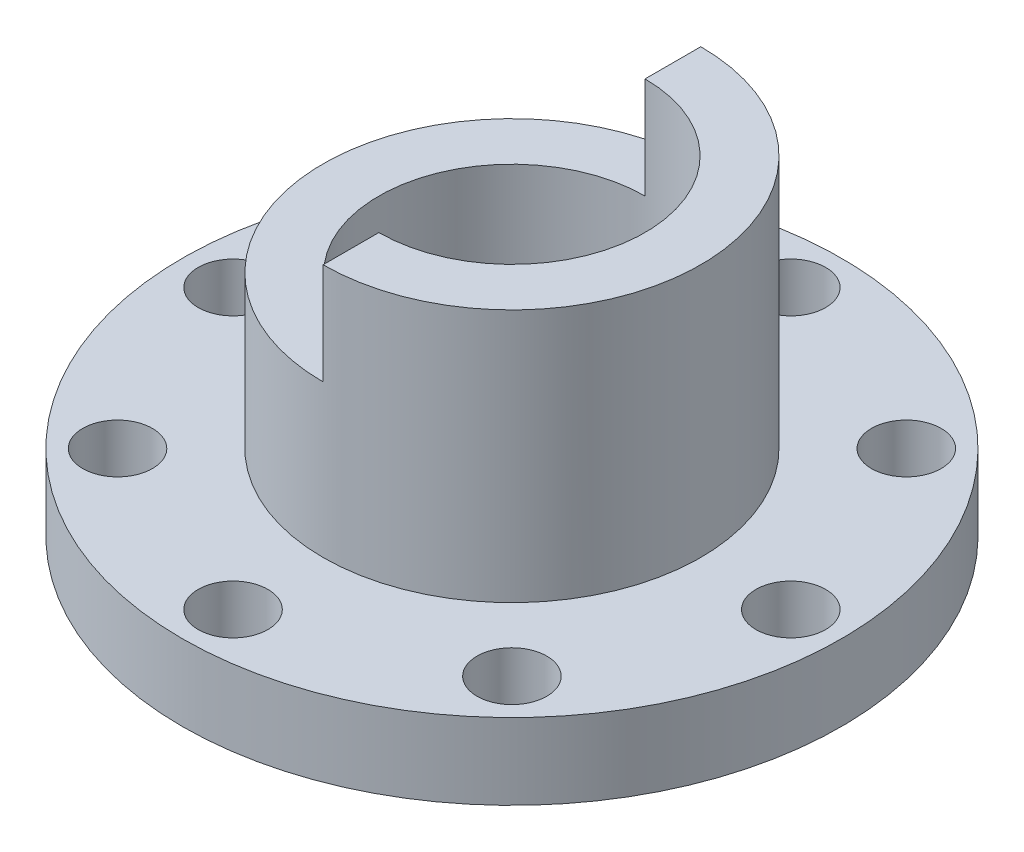
ISO-10303-21;
HEADER;
FILE_DESCRIPTION(('STEP AP214'),'2;1');
FILE_NAME('part.step','',(''),(''),'','','');
FILE_SCHEMA(('AUTOMOTIVE_DESIGN { 1 0 10303 214 1 1 1 1 }'));
ENDSEC;
DATA;
#1=APPLICATION_CONTEXT('core data for automotive mechanical design processes');
#2=APPLICATION_PROTOCOL_DEFINITION('international standard','automotive_design',2000,#1);
#3=PRODUCT_CONTEXT('',#1,'mechanical');
#4=PRODUCT('Part','Part','',(#3));
#5=PRODUCT_RELATED_PRODUCT_CATEGORY('part','',(#4));
#6=PRODUCT_DEFINITION_FORMATION('','',#4);
#7=PRODUCT_DEFINITION_CONTEXT('part definition',#1,'design');
#8=PRODUCT_DEFINITION('design','',#6,#7);
#9=PRODUCT_DEFINITION_SHAPE('','',#8);
#10=(LENGTH_UNIT() NAMED_UNIT(*) SI_UNIT(.MILLI.,.METRE.));
#11=(NAMED_UNIT(*) PLANE_ANGLE_UNIT() SI_UNIT($,.RADIAN.));
#12=(NAMED_UNIT(*) SI_UNIT($,.STERADIAN.) SOLID_ANGLE_UNIT());
#13=UNCERTAINTY_MEASURE_WITH_UNIT(LENGTH_MEASURE(1.E-05),#10,'distance_accuracy_value','');
#14=(GEOMETRIC_REPRESENTATION_CONTEXT(3) GLOBAL_UNCERTAINTY_ASSIGNED_CONTEXT((#13)) GLOBAL_UNIT_ASSIGNED_CONTEXT((#10,
#11,#12)) REPRESENTATION_CONTEXT('',''));
#15=CARTESIAN_POINT('',(0.,0.,0.));
#16=DIRECTION('',(0.,0.,1.));
#17=DIRECTION('',(1.,0.,0.));
#18=AXIS2_PLACEMENT_3D('',#15,#16,#17);
#19=CARTESIAN_POINT('',(0.,13.,0.));
#20=DIRECTION('',(0.,1.,0.));
#21=DIRECTION('',(0.,0.,1.));
#22=AXIS2_PLACEMENT_3D('',#19,#20,#21);
#23=PLANE('',#22);
#24=DIRECTION('',(0.,0.,1.));
#25=VECTOR('',#24,1.);
#26=CARTESIAN_POINT('',(0.,13.,0.));
#27=LINE('',#26,#25);
#28=CARTESIAN_POINT('',(0.,13.,5.25));
#29=VERTEX_POINT('',#28);
#30=CARTESIAN_POINT('',(0.,13.,7.45));
#31=VERTEX_POINT('',#30);
#32=EDGE_CURVE('E93',#29,#31,#27,.T.);
#33=ORIENTED_EDGE('',*,*,#32,.T.);
#34=CARTESIAN_POINT('',(0.,13.,0.));
#35=DIRECTION('',(0.,1.,0.));
#36=DIRECTION('',(0.,0.,1.));
#37=AXIS2_PLACEMENT_3D('',#34,#35,#36);
#38=CIRCLE('',#37,7.45);
#39=CARTESIAN_POINT('',(0.,13.,-7.45));
#40=VERTEX_POINT('',#39);
#41=EDGE_CURVE('E80',#31,#40,#38,.T.);
#42=ORIENTED_EDGE('',*,*,#41,.T.);
#43=CARTESIAN_POINT('',(0.,13.,-5.25));
#44=VERTEX_POINT('',#43);
#45=EDGE_CURVE('E102',#40,#44,#27,.T.);
#46=ORIENTED_EDGE('',*,*,#45,.T.);
#47=CARTESIAN_POINT('',(0.,13.,0.));
#48=DIRECTION('',(0.,1.,0.));
#49=DIRECTION('',(0.,0.,1.));
#50=AXIS2_PLACEMENT_3D('',#47,#48,#49);
#51=CIRCLE('',#50,5.25);
#52=EDGE_CURVE('E99',#29,#44,#51,.T.);
#53=ORIENTED_EDGE('',*,*,#52,.F.);
#54=EDGE_LOOP('',(#33,#42,#46,#53));
#55=FACE_BOUND('',#54,.T.);
#56=ADVANCED_FACE('F40',(#55),#23,.T.);
#57=CARTESIAN_POINT('',(0.,9.,0.));
#58=DIRECTION('',(-1.,0.,0.));
#59=DIRECTION('',(0.,0.,1.));
#60=AXIS2_PLACEMENT_3D('',#57,#58,#59);
#61=PLANE('',#60);
#62=ORIENTED_EDGE('',*,*,#45,.F.);
#63=DIRECTION('',(0.,1.,0.));
#64=VECTOR('',#63,1.);
#65=CARTESIAN_POINT('',(0.,3.,-7.45));
#66=LINE('',#65,#64);
#67=CARTESIAN_POINT('',(0.,9.,-7.45));
#68=VERTEX_POINT('',#67);
#69=EDGE_CURVE('E84',#40,#68,#66,.F.);
#70=ORIENTED_EDGE('',*,*,#69,.T.);
#71=DIRECTION('',(0.,0.,1.));
#72=VECTOR('',#71,1.);
#73=CARTESIAN_POINT('',(0.,9.,0.));
#74=LINE('',#73,#72);
#75=CARTESIAN_POINT('',(0.,9.,-5.25));
#76=VERTEX_POINT('',#75);
#77=EDGE_CURVE('E101',#68,#76,#74,.T.);
#78=ORIENTED_EDGE('',*,*,#77,.T.);
#79=DIRECTION('',(0.,1.,0.));
#80=VECTOR('',#79,1.);
#81=CARTESIAN_POINT('',(0.,9.,-5.25));
#82=LINE('',#81,#80);
#83=EDGE_CURVE('E110',#76,#44,#82,.T.);
#84=ORIENTED_EDGE('',*,*,#83,.T.);
#85=EDGE_LOOP('',(#62,#70,#78,#84));
#86=FACE_BOUND('',#85,.T.);
#87=ADVANCED_FACE('F210',(#86),#61,.T.);
#88=CARTESIAN_POINT('',(0.,9.,5.25));
#89=VERTEX_POINT('',#88);
#90=CARTESIAN_POINT('',(0.,9.,7.45));
#91=VERTEX_POINT('',#90);
#92=EDGE_CURVE('E62',#89,#91,#74,.T.);
#93=ORIENTED_EDGE('',*,*,#92,.T.);
#94=DIRECTION('',(0.,1.,0.));
#95=VECTOR('',#94,1.);
#96=CARTESIAN_POINT('',(0.,3.,7.45));
#97=LINE('',#96,#95);
#98=EDGE_CURVE('E56',#91,#31,#97,.T.);
#99=ORIENTED_EDGE('',*,*,#98,.T.);
#100=ORIENTED_EDGE('',*,*,#32,.F.);
#101=DIRECTION('',(0.,1.,0.));
#102=VECTOR('',#101,1.);
#103=CARTESIAN_POINT('',(0.,9.,5.25));
#104=LINE('',#103,#102);
#105=EDGE_CURVE('E114',#89,#29,#104,.T.);
#106=ORIENTED_EDGE('',*,*,#105,.F.);
#107=EDGE_LOOP('',(#93,#99,#100,#106));
#108=FACE_BOUND('',#107,.T.);
#109=ADVANCED_FACE('F92',(#108),#61,.T.);
#110=CARTESIAN_POINT('',(0.,9.,0.));
#111=DIRECTION('',(0.,1.,0.));
#112=DIRECTION('',(0.,0.,1.));
#113=AXIS2_PLACEMENT_3D('',#110,#111,#112);
#114=PLANE('',#113);
#115=ORIENTED_EDGE('',*,*,#77,.F.);
#116=CARTESIAN_POINT('',(0.,9.,0.));
#117=DIRECTION('',(0.,1.,0.));
#118=DIRECTION('',(0.,0.,1.));
#119=AXIS2_PLACEMENT_3D('',#116,#117,#118);
#120=CIRCLE('',#119,7.45);
#121=EDGE_CURVE('E11',#68,#91,#120,.T.);
#122=ORIENTED_EDGE('',*,*,#121,.T.);
#123=ORIENTED_EDGE('',*,*,#92,.F.);
#124=CARTESIAN_POINT('',(0.,9.,0.));
#125=DIRECTION('',(0.,1.,0.));
#126=DIRECTION('',(0.,0.,1.));
#127=AXIS2_PLACEMENT_3D('',#124,#125,#126);
#128=CIRCLE('',#127,5.25);
#129=EDGE_CURVE('E109',#89,#76,#128,.F.);
#130=ORIENTED_EDGE('',*,*,#129,.T.);
#131=EDGE_LOOP('',(#115,#122,#123,#130));
#132=FACE_BOUND('',#131,.T.);
#133=ADVANCED_FACE('F230',(#132),#114,.T.);
#134=CARTESIAN_POINT('',(0.,-5.,0.));
#135=DIRECTION('',(0.,1.,0.));
#136=DIRECTION('',(0.,0.,1.));
#137=AXIS2_PLACEMENT_3D('',#134,#135,#136);
#138=CYLINDRICAL_SURFACE('',#137,5.25);
#139=CARTESIAN_POINT('',(0.,0.,0.));
#140=DIRECTION('',(0.,1.,0.));
#141=DIRECTION('',(0.,0.,1.));
#142=AXIS2_PLACEMENT_3D('',#139,#140,#141);
#143=CIRCLE('',#142,5.25);
#144=CARTESIAN_POINT('',(0.,0.,5.25));
#145=VERTEX_POINT('',#144);
#146=EDGE_CURVE('E119',#145,#145,#143,.T.);
#147=ORIENTED_EDGE('',*,*,#146,.F.);
#148=EDGE_LOOP('',(#147));
#149=FACE_BOUND('',#148,.T.);
#150=ORIENTED_EDGE('',*,*,#83,.F.);
#151=ORIENTED_EDGE('',*,*,#129,.F.);
#152=ORIENTED_EDGE('',*,*,#105,.T.);
#153=ORIENTED_EDGE('',*,*,#52,.T.);
#154=EDGE_LOOP('',(#150,#151,#152,#153));
#155=FACE_BOUND('',#154,.T.);
#156=ADVANCED_FACE('F218',(#149,#155),#138,.F.);
#157=CARTESIAN_POINT('',(0.,3.,0.));
#158=DIRECTION('',(0.,1.,0.));
#159=DIRECTION('',(0.,0.,1.));
#160=AXIS2_PLACEMENT_3D('',#157,#158,#159);
#161=PLANE('',#160);
#162=CARTESIAN_POINT('',(0.,3.,0.));
#163=DIRECTION('',(0.,1.,0.));
#164=DIRECTION('',(0.,0.,1.));
#165=AXIS2_PLACEMENT_3D('',#162,#163,#164);
#166=CIRCLE('',#165,13.);
#167=CARTESIAN_POINT('',(0.,3.,13.));
#168=VERTEX_POINT('',#167);
#169=EDGE_CURVE('E49',#168,#168,#166,.T.);
#170=ORIENTED_EDGE('',*,*,#169,.T.);
#171=EDGE_LOOP('',(#170));
#172=FACE_BOUND('',#171,.T.);
#173=CARTESIAN_POINT('',(-7.77817459305189,3.,-7.77817459305169));
#174=DIRECTION('',(0.,1.,0.));
#175=DIRECTION('',(0.,0.,1.));
#176=AXIS2_PLACEMENT_3D('',#173,#174,#175);
#177=CIRCLE('',#176,1.37500000000036);
#178=CARTESIAN_POINT('',(-7.77817459305189,3.,-6.40317459305133));
#179=VERTEX_POINT('',#178);
#180=EDGE_CURVE('E153',#179,#179,#177,.T.);
#181=ORIENTED_EDGE('',*,*,#180,.F.);
#182=EDGE_LOOP('',(#181));
#183=FACE_BOUND('',#182,.T.);
#184=CARTESIAN_POINT('',(0.,3.,-11.));
#185=DIRECTION('',(0.,1.,0.));
#186=DIRECTION('',(0.,0.,1.));
#187=AXIS2_PLACEMENT_3D('',#184,#185,#186);
#188=CIRCLE('',#187,1.375);
#189=CARTESIAN_POINT('',(0.,3.,-9.625));
#190=VERTEX_POINT('',#189);
#191=EDGE_CURVE('E149',#190,#190,#188,.T.);
#192=ORIENTED_EDGE('',*,*,#191,.F.);
#193=EDGE_LOOP('',(#192));
#194=FACE_BOUND('',#193,.T.);
#195=CARTESIAN_POINT('',(7.77817459305216,3.,-7.77817459305235));
#196=DIRECTION('',(0.,1.,0.));
#197=DIRECTION('',(0.,0.,1.));
#198=AXIS2_PLACEMENT_3D('',#195,#196,#197);
#199=CIRCLE('',#198,1.37500000000005);
#200=CARTESIAN_POINT('',(7.77817459305216,3.,-6.4031745930523));
#201=VERTEX_POINT('',#200);
#202=EDGE_CURVE('E145',#201,#201,#199,.T.);
#203=ORIENTED_EDGE('',*,*,#202,.F.);
#204=EDGE_LOOP('',(#203));
#205=FACE_BOUND('',#204,.T.);
#206=CARTESIAN_POINT('',(11.0000000000005,3.,-4.66937538383073E-13));
#207=DIRECTION('',(0.,1.,0.));
#208=DIRECTION('',(0.,0.,1.));
#209=AXIS2_PLACEMENT_3D('',#206,#207,#208);
#210=CIRCLE('',#209,1.37500000000035);
#211=CARTESIAN_POINT('',(11.0000000000005,3.,1.37499999999988));
#212=VERTEX_POINT('',#211);
#213=EDGE_CURVE('E141',#212,#212,#210,.T.);
#214=ORIENTED_EDGE('',*,*,#213,.F.);
#215=EDGE_LOOP('',(#214));
#216=FACE_BOUND('',#215,.T.);
#217=CARTESIAN_POINT('',(7.77817459305282,3.,7.77817459305169));
#218=DIRECTION('',(0.,1.,0.));
#219=DIRECTION('',(0.,0.,1.));
#220=AXIS2_PLACEMENT_3D('',#217,#218,#219);
#221=CIRCLE('',#220,1.37500000000072);
#222=CARTESIAN_POINT('',(7.77817459305282,3.,9.15317459305241));
#223=VERTEX_POINT('',#222);
#224=EDGE_CURVE('E137',#223,#223,#221,.T.);
#225=ORIENTED_EDGE('',*,*,#224,.F.);
#226=EDGE_LOOP('',(#225));
#227=FACE_BOUND('',#226,.T.);
#228=CARTESIAN_POINT('',(9.33875076766146E-13,3.,11.));
#229=DIRECTION('',(0.,1.,0.));
#230=DIRECTION('',(0.,0.,1.));
#231=AXIS2_PLACEMENT_3D('',#228,#229,#230);
#232=CIRCLE('',#231,1.37500000000097);
#233=CARTESIAN_POINT('',(9.33875076766146E-13,3.,12.375000000001));
#234=VERTEX_POINT('',#233);
#235=EDGE_CURVE('E133',#234,#234,#232,.T.);
#236=ORIENTED_EDGE('',*,*,#235,.F.);
#237=EDGE_LOOP('',(#236));
#238=FACE_BOUND('',#237,.T.);
#239=CARTESIAN_POINT('',(-7.77817459305123,3.,7.77817459305236));
#240=DIRECTION('',(0.,1.,0.));
#241=DIRECTION('',(0.,0.,1.));
#242=AXIS2_PLACEMENT_3D('',#239,#240,#241);
#243=CIRCLE('',#242,1.37500000000095);
#244=CARTESIAN_POINT('',(-7.77817459305123,3.,9.15317459305331));
#245=VERTEX_POINT('',#244);
#246=EDGE_CURVE('E128',#245,#245,#243,.T.);
#247=ORIENTED_EDGE('',*,*,#246,.F.);
#248=EDGE_LOOP('',(#247));
#249=FACE_BOUND('',#248,.T.);
#250=CARTESIAN_POINT('',(-10.9999999999995,3.,4.68284649862135E-13));
#251=DIRECTION('',(0.,1.,0.));
#252=DIRECTION('',(0.,0.,1.));
#253=AXIS2_PLACEMENT_3D('',#250,#251,#252);
#254=CIRCLE('',#253,1.37500000000069);
#255=CARTESIAN_POINT('',(-10.9999999999995,3.,1.37500000000116));
#256=VERTEX_POINT('',#255);
#257=EDGE_CURVE('E124',#256,#256,#254,.T.);
#258=ORIENTED_EDGE('',*,*,#257,.F.);
#259=EDGE_LOOP('',(#258));
#260=FACE_BOUND('',#259,.T.);
#261=CARTESIAN_POINT('',(0.,3.,0.));
#262=DIRECTION('',(0.,1.,0.));
#263=DIRECTION('',(0.,0.,1.));
#264=AXIS2_PLACEMENT_3D('',#261,#262,#263);
#265=CIRCLE('',#264,7.45);
#266=CARTESIAN_POINT('',(0.,3.,7.45));
#267=VERTEX_POINT('',#266);
#268=EDGE_CURVE('E89',#267,#267,#265,.T.);
#269=ORIENTED_EDGE('',*,*,#268,.F.);
#270=EDGE_LOOP('',(#269));
#271=FACE_BOUND('',#270,.T.);
#272=ADVANCED_FACE('F219',(#172,#183,#194,#205,#216,#227,#238,#249,#260,#271),#161,.T.);
#273=CARTESIAN_POINT('',(-7.77817459305189,3.,-7.77817459305169));
#274=DIRECTION('',(0.,-1.,0.));
#275=DIRECTION('',(0.,0.,-1.));
#276=AXIS2_PLACEMENT_3D('',#273,#274,#275);
#277=CYLINDRICAL_SURFACE('',#276,1.37500000000036);
#278=ORIENTED_EDGE('',*,*,#180,.T.);
#279=EDGE_LOOP('',(#278));
#280=FACE_BOUND('',#279,.T.);
#281=CARTESIAN_POINT('',(-7.77817459305189,0.,-7.77817459305169));
#282=DIRECTION('',(0.,1.,0.));
#283=DIRECTION('',(0.,0.,1.));
#284=AXIS2_PLACEMENT_3D('',#281,#282,#283);
#285=CIRCLE('',#284,1.37500000000036);
#286=CARTESIAN_POINT('',(-7.77817459305189,0.,-6.40317459305133));
#287=VERTEX_POINT('',#286);
#288=EDGE_CURVE('E187',#287,#287,#285,.T.);
#289=ORIENTED_EDGE('',*,*,#288,.F.);
#290=EDGE_LOOP('',(#289));
#291=FACE_BOUND('',#290,.T.);
#292=ADVANCED_FACE('F221',(#280,#291),#277,.F.);
#293=CARTESIAN_POINT('',(0.,3.,-11.));
#294=DIRECTION('',(0.,-1.,0.));
#295=DIRECTION('',(0.,0.,-1.));
#296=AXIS2_PLACEMENT_3D('',#293,#294,#295);
#297=CYLINDRICAL_SURFACE('',#296,1.375);
#298=ORIENTED_EDGE('',*,*,#191,.T.);
#299=EDGE_LOOP('',(#298));
#300=FACE_BOUND('',#299,.T.);
#301=CARTESIAN_POINT('',(0.,0.,-11.));
#302=DIRECTION('',(0.,1.,0.));
#303=DIRECTION('',(0.,0.,1.));
#304=AXIS2_PLACEMENT_3D('',#301,#302,#303);
#305=CIRCLE('',#304,1.375);
#306=CARTESIAN_POINT('',(0.,0.,-9.625));
#307=VERTEX_POINT('',#306);
#308=EDGE_CURVE('E183',#307,#307,#305,.T.);
#309=ORIENTED_EDGE('',*,*,#308,.F.);
#310=EDGE_LOOP('',(#309));
#311=FACE_BOUND('',#310,.T.);
#312=ADVANCED_FACE('F227',(#300,#311),#297,.F.);
#313=CARTESIAN_POINT('',(7.77817459305216,3.,-7.77817459305235));
#314=DIRECTION('',(0.,-1.,0.));
#315=DIRECTION('',(0.,0.,-1.));
#316=AXIS2_PLACEMENT_3D('',#313,#314,#315);
#317=CYLINDRICAL_SURFACE('',#316,1.37500000000005);
#318=ORIENTED_EDGE('',*,*,#202,.T.);
#319=EDGE_LOOP('',(#318));
#320=FACE_BOUND('',#319,.T.);
#321=CARTESIAN_POINT('',(7.77817459305216,0.,-7.77817459305235));
#322=DIRECTION('',(0.,1.,0.));
#323=DIRECTION('',(0.,0.,1.));
#324=AXIS2_PLACEMENT_3D('',#321,#322,#323);
#325=CIRCLE('',#324,1.37500000000005);
#326=CARTESIAN_POINT('',(7.77817459305216,0.,-6.4031745930523));
#327=VERTEX_POINT('',#326);
#328=EDGE_CURVE('E179',#327,#327,#325,.T.);
#329=ORIENTED_EDGE('',*,*,#328,.F.);
#330=EDGE_LOOP('',(#329));
#331=FACE_BOUND('',#330,.T.);
#332=ADVANCED_FACE('F345',(#320,#331),#317,.F.);
#333=CARTESIAN_POINT('',(11.0000000000005,3.,-4.66937538383073E-13));
#334=DIRECTION('',(0.,-1.,0.));
#335=DIRECTION('',(0.,0.,-1.));
#336=AXIS2_PLACEMENT_3D('',#333,#334,#335);
#337=CYLINDRICAL_SURFACE('',#336,1.37500000000035);
#338=ORIENTED_EDGE('',*,*,#213,.T.);
#339=EDGE_LOOP('',(#338));
#340=FACE_BOUND('',#339,.T.);
#341=CARTESIAN_POINT('',(11.0000000000005,0.,-4.66937538383073E-13));
#342=DIRECTION('',(0.,1.,0.));
#343=DIRECTION('',(0.,0.,1.));
#344=AXIS2_PLACEMENT_3D('',#341,#342,#343);
#345=CIRCLE('',#344,1.37500000000035);
#346=CARTESIAN_POINT('',(11.0000000000005,0.,1.37499999999988));
#347=VERTEX_POINT('',#346);
#348=EDGE_CURVE('E175',#347,#347,#345,.T.);
#349=ORIENTED_EDGE('',*,*,#348,.F.);
#350=EDGE_LOOP('',(#349));
#351=FACE_BOUND('',#350,.T.);
#352=ADVANCED_FACE('F335',(#340,#351),#337,.F.);
#353=CARTESIAN_POINT('',(7.77817459305282,3.,7.77817459305169));
#354=DIRECTION('',(0.,-1.,0.));
#355=DIRECTION('',(0.,0.,-1.));
#356=AXIS2_PLACEMENT_3D('',#353,#354,#355);
#357=CYLINDRICAL_SURFACE('',#356,1.37500000000072);
#358=ORIENTED_EDGE('',*,*,#224,.T.);
#359=EDGE_LOOP('',(#358));
#360=FACE_BOUND('',#359,.T.);
#361=CARTESIAN_POINT('',(7.77817459305282,0.,7.77817459305169));
#362=DIRECTION('',(0.,1.,0.));
#363=DIRECTION('',(0.,0.,1.));
#364=AXIS2_PLACEMENT_3D('',#361,#362,#363);
#365=CIRCLE('',#364,1.37500000000072);
#366=CARTESIAN_POINT('',(7.77817459305282,0.,9.15317459305241));
#367=VERTEX_POINT('',#366);
#368=EDGE_CURVE('E171',#367,#367,#365,.T.);
#369=ORIENTED_EDGE('',*,*,#368,.F.);
#370=EDGE_LOOP('',(#369));
#371=FACE_BOUND('',#370,.T.);
#372=ADVANCED_FACE('F325',(#360,#371),#357,.F.);
#373=CARTESIAN_POINT('',(9.33875076766146E-13,3.,11.));
#374=DIRECTION('',(0.,-1.,0.));
#375=DIRECTION('',(0.,0.,-1.));
#376=AXIS2_PLACEMENT_3D('',#373,#374,#375);
#377=CYLINDRICAL_SURFACE('',#376,1.37500000000097);
#378=ORIENTED_EDGE('',*,*,#235,.T.);
#379=EDGE_LOOP('',(#378));
#380=FACE_BOUND('',#379,.T.);
#381=CARTESIAN_POINT('',(9.33875076766146E-13,0.,11.));
#382=DIRECTION('',(0.,1.,0.));
#383=DIRECTION('',(0.,0.,1.));
#384=AXIS2_PLACEMENT_3D('',#381,#382,#383);
#385=CIRCLE('',#384,1.37500000000097);
#386=CARTESIAN_POINT('',(9.33875076766146E-13,0.,12.375000000001));
#387=VERTEX_POINT('',#386);
#388=EDGE_CURVE('E167',#387,#387,#385,.T.);
#389=ORIENTED_EDGE('',*,*,#388,.F.);
#390=EDGE_LOOP('',(#389));
#391=FACE_BOUND('',#390,.T.);
#392=ADVANCED_FACE('F316',(#380,#391),#377,.F.);
#393=CARTESIAN_POINT('',(-7.77817459305123,3.,7.77817459305236));
#394=DIRECTION('',(0.,-1.,0.));
#395=DIRECTION('',(0.,0.,-1.));
#396=AXIS2_PLACEMENT_3D('',#393,#394,#395);
#397=CYLINDRICAL_SURFACE('',#396,1.37500000000095);
#398=ORIENTED_EDGE('',*,*,#246,.T.);
#399=EDGE_LOOP('',(#398));
#400=FACE_BOUND('',#399,.T.);
#401=CARTESIAN_POINT('',(-7.77817459305123,0.,7.77817459305236));
#402=DIRECTION('',(0.,1.,0.));
#403=DIRECTION('',(0.,0.,1.));
#404=AXIS2_PLACEMENT_3D('',#401,#402,#403);
#405=CIRCLE('',#404,1.37500000000095);
#406=CARTESIAN_POINT('',(-7.77817459305123,0.,9.15317459305331));
#407=VERTEX_POINT('',#406);
#408=EDGE_CURVE('E163',#407,#407,#405,.T.);
#409=ORIENTED_EDGE('',*,*,#408,.F.);
#410=EDGE_LOOP('',(#409));
#411=FACE_BOUND('',#410,.T.);
#412=ADVANCED_FACE('F307',(#400,#411),#397,.F.);
#413=CARTESIAN_POINT('',(-10.9999999999995,3.,4.68284649862135E-13));
#414=DIRECTION('',(0.,-1.,0.));
#415=DIRECTION('',(0.,0.,-1.));
#416=AXIS2_PLACEMENT_3D('',#413,#414,#415);
#417=CYLINDRICAL_SURFACE('',#416,1.37500000000069);
#418=ORIENTED_EDGE('',*,*,#257,.T.);
#419=EDGE_LOOP('',(#418));
#420=FACE_BOUND('',#419,.T.);
#421=CARTESIAN_POINT('',(-10.9999999999995,0.,4.68284649862135E-13));
#422=DIRECTION('',(0.,1.,0.));
#423=DIRECTION('',(0.,0.,1.));
#424=AXIS2_PLACEMENT_3D('',#421,#422,#423);
#425=CIRCLE('',#424,1.37500000000069);
#426=CARTESIAN_POINT('',(-10.9999999999995,0.,1.37500000000116));
#427=VERTEX_POINT('',#426);
#428=EDGE_CURVE('E123',#427,#427,#425,.T.);
#429=ORIENTED_EDGE('',*,*,#428,.F.);
#430=EDGE_LOOP('',(#429));
#431=FACE_BOUND('',#430,.T.);
#432=ADVANCED_FACE('F42',(#420,#431),#417,.F.);
#433=CARTESIAN_POINT('',(0.,3.,0.));
#434=DIRECTION('',(0.,-1.,0.));
#435=DIRECTION('',(0.,0.,-1.));
#436=AXIS2_PLACEMENT_3D('',#433,#434,#435);
#437=CYLINDRICAL_SURFACE('',#436,13.);
#438=ORIENTED_EDGE('',*,*,#169,.F.);
#439=EDGE_LOOP('',(#438));
#440=FACE_BOUND('',#439,.T.);
#441=CARTESIAN_POINT('',(0.,0.,0.));
#442=DIRECTION('',(0.,1.,0.));
#443=DIRECTION('',(0.,0.,1.));
#444=AXIS2_PLACEMENT_3D('',#441,#442,#443);
#445=CIRCLE('',#444,13.);
#446=CARTESIAN_POINT('',(0.,0.,13.));
#447=VERTEX_POINT('',#446);
#448=EDGE_CURVE('E129',#447,#447,#445,.T.);
#449=ORIENTED_EDGE('',*,*,#448,.T.);
#450=EDGE_LOOP('',(#449));
#451=FACE_BOUND('',#450,.T.);
#452=ADVANCED_FACE('F194',(#440,#451),#437,.T.);
#453=CARTESIAN_POINT('',(0.,0.,0.));
#454=DIRECTION('',(0.,1.,0.));
#455=DIRECTION('',(0.,0.,1.));
#456=AXIS2_PLACEMENT_3D('',#453,#454,#455);
#457=PLANE('',#456);
#458=ORIENTED_EDGE('',*,*,#146,.T.);
#459=EDGE_LOOP('',(#458));
#460=FACE_BOUND('',#459,.T.);
#461=ORIENTED_EDGE('',*,*,#428,.T.);
#462=EDGE_LOOP('',(#461));
#463=FACE_BOUND('',#462,.T.);
#464=ORIENTED_EDGE('',*,*,#408,.T.);
#465=EDGE_LOOP('',(#464));
#466=FACE_BOUND('',#465,.T.);
#467=ORIENTED_EDGE('',*,*,#388,.T.);
#468=EDGE_LOOP('',(#467));
#469=FACE_BOUND('',#468,.T.);
#470=ORIENTED_EDGE('',*,*,#368,.T.);
#471=EDGE_LOOP('',(#470));
#472=FACE_BOUND('',#471,.T.);
#473=ORIENTED_EDGE('',*,*,#348,.T.);
#474=EDGE_LOOP('',(#473));
#475=FACE_BOUND('',#474,.T.);
#476=ORIENTED_EDGE('',*,*,#328,.T.);
#477=EDGE_LOOP('',(#476));
#478=FACE_BOUND('',#477,.T.);
#479=ORIENTED_EDGE('',*,*,#308,.T.);
#480=EDGE_LOOP('',(#479));
#481=FACE_BOUND('',#480,.T.);
#482=ORIENTED_EDGE('',*,*,#288,.T.);
#483=EDGE_LOOP('',(#482));
#484=FACE_BOUND('',#483,.T.);
#485=ORIENTED_EDGE('',*,*,#448,.F.);
#486=EDGE_LOOP('',(#485));
#487=FACE_BOUND('',#486,.T.);
#488=ADVANCED_FACE('F196',(#460,#463,#466,#469,#472,#475,#478,#481,#484,#487),#457,.F.);
#489=CARTESIAN_POINT('',(0.,3.,0.));
#490=DIRECTION('',(0.,1.,0.));
#491=DIRECTION('',(0.,0.,1.));
#492=AXIS2_PLACEMENT_3D('',#489,#490,#491);
#493=CYLINDRICAL_SURFACE('',#492,7.45);
#494=ORIENTED_EDGE('',*,*,#41,.F.);
#495=ORIENTED_EDGE('',*,*,#98,.F.);
#496=ORIENTED_EDGE('',*,*,#121,.F.);
#497=ORIENTED_EDGE('',*,*,#69,.F.);
#498=EDGE_LOOP('',(#494,#495,#496,#497));
#499=FACE_BOUND('',#498,.T.);
#500=ORIENTED_EDGE('',*,*,#268,.T.);
#501=EDGE_LOOP('',(#500));
#502=FACE_BOUND('',#501,.T.);
#503=ADVANCED_FACE('F81',(#499,#502),#493,.T.);
#504=CLOSED_SHELL('',(#56,#87,#109,#133,#156,#272,#292,#312,#332,#352,#372,#392,#412,#432,#452,
#488,#503));
#505=MANIFOLD_SOLID_BREP('B2',#504);
#506=ADVANCED_BREP_SHAPE_REPRESENTATION('',(#18,#505),#14);
#507=SHAPE_DEFINITION_REPRESENTATION(#9,#506);
ENDSEC;
END-ISO-10303-21;
